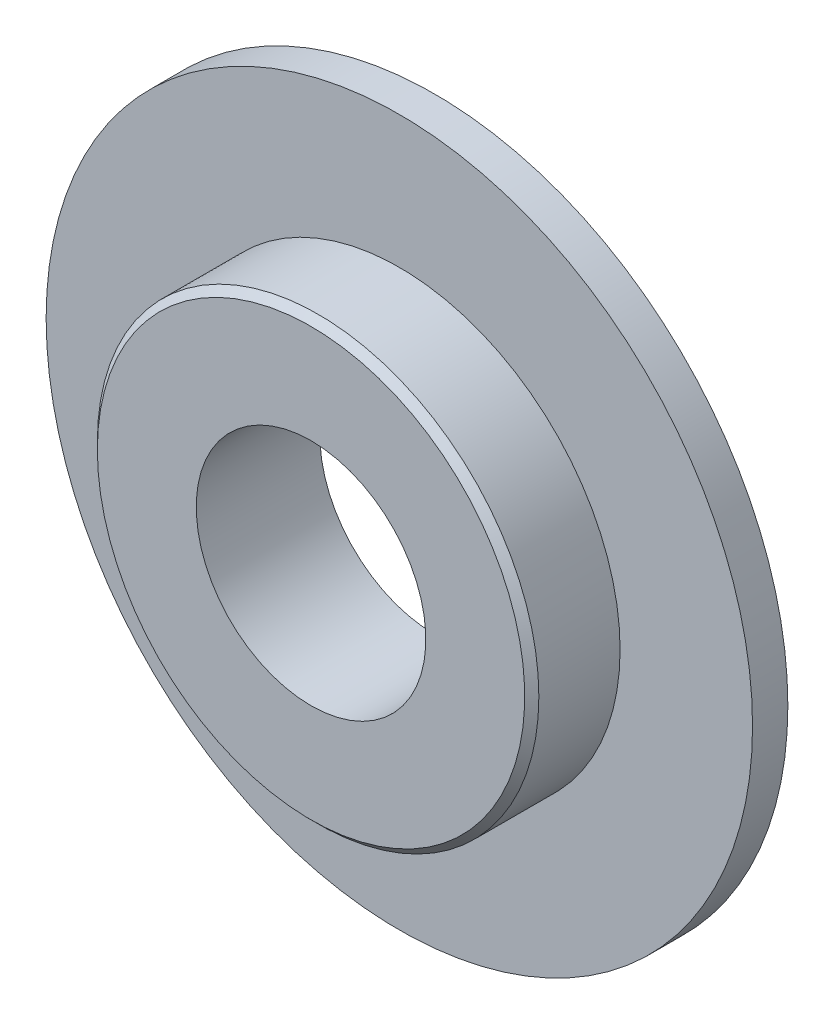
ISO-10303-21;
HEADER;
FILE_DESCRIPTION(('STEP AP214'),'2;1');
FILE_NAME('part.step','',(''),(''),'','','');
FILE_SCHEMA(('AUTOMOTIVE_DESIGN { 1 0 10303 214 1 1 1 1 }'));
ENDSEC;
DATA;
#1=APPLICATION_CONTEXT('core data for automotive mechanical design processes');
#2=APPLICATION_PROTOCOL_DEFINITION('international standard','automotive_design',2000,#1);
#3=PRODUCT_CONTEXT('',#1,'mechanical');
#4=PRODUCT('Part','Part','',(#3));
#5=PRODUCT_RELATED_PRODUCT_CATEGORY('part','',(#4));
#6=PRODUCT_DEFINITION_FORMATION('','',#4);
#7=PRODUCT_DEFINITION_CONTEXT('part definition',#1,'design');
#8=PRODUCT_DEFINITION('design','',#6,#7);
#9=PRODUCT_DEFINITION_SHAPE('','',#8);
#10=(LENGTH_UNIT() NAMED_UNIT(*) SI_UNIT(.MILLI.,.METRE.));
#11=(NAMED_UNIT(*) PLANE_ANGLE_UNIT() SI_UNIT($,.RADIAN.));
#12=(NAMED_UNIT(*) SI_UNIT($,.STERADIAN.) SOLID_ANGLE_UNIT());
#13=UNCERTAINTY_MEASURE_WITH_UNIT(LENGTH_MEASURE(1.E-05),#10,'distance_accuracy_value','');
#14=(GEOMETRIC_REPRESENTATION_CONTEXT(3) GLOBAL_UNCERTAINTY_ASSIGNED_CONTEXT((#13)) GLOBAL_UNIT_ASSIGNED_CONTEXT((#10,
#11,#12)) REPRESENTATION_CONTEXT('',''));
#15=CARTESIAN_POINT('',(0.,0.,0.));
#16=DIRECTION('',(0.,0.,1.));
#17=DIRECTION('',(1.,0.,0.));
#18=AXIS2_PLACEMENT_3D('',#15,#16,#17);
#19=CARTESIAN_POINT('',(0.,0.,-0.999999999999903));
#20=DIRECTION('',(0.,0.,1.));
#21=DIRECTION('',(1.,0.,0.));
#22=AXIS2_PLACEMENT_3D('',#19,#20,#21);
#23=CYLINDRICAL_SURFACE('',#22,10.);
#24=CARTESIAN_POINT('',(0.,0.,-0.999999999999903));
#25=DIRECTION('',(0.,0.,-1.));
#26=DIRECTION('',(-1.,0.,0.));
#27=AXIS2_PLACEMENT_3D('',#24,#25,#26);
#28=CIRCLE('',#27,10.);
#29=CARTESIAN_POINT('',(-10.,0.,-0.999999999999903));
#30=VERTEX_POINT('',#29);
#31=EDGE_CURVE('E46',#30,#30,#28,.T.);
#32=ORIENTED_EDGE('',*,*,#31,.F.);
#33=EDGE_LOOP('',(#32));
#34=FACE_BOUND('',#33,.T.);
#35=CARTESIAN_POINT('',(0.,0.,0.));
#36=DIRECTION('',(0.,0.,-1.));
#37=DIRECTION('',(-1.,0.,0.));
#38=AXIS2_PLACEMENT_3D('',#35,#36,#37);
#39=CIRCLE('',#38,10.);
#40=CARTESIAN_POINT('',(-10.,0.,0.));
#41=VERTEX_POINT('',#40);
#42=EDGE_CURVE('E49',#41,#41,#39,.T.);
#43=ORIENTED_EDGE('',*,*,#42,.T.);
#44=EDGE_LOOP('',(#43));
#45=FACE_BOUND('',#44,.T.);
#46=ADVANCED_FACE('F31',(#34,#45),#23,.T.);
#47=CARTESIAN_POINT('',(0.,0.,-0.999999999999903));
#48=DIRECTION('',(0.,0.,-1.));
#49=DIRECTION('',(-1.,0.,0.));
#50=AXIS2_PLACEMENT_3D('',#47,#48,#49);
#51=PLANE('',#50);
#52=CARTESIAN_POINT('',(0.,0.,-0.999999999999903));
#53=DIRECTION('',(0.,0.,-1.));
#54=DIRECTION('',(0.,1.,0.));
#55=AXIS2_PLACEMENT_3D('',#52,#53,#54);
#56=CIRCLE('',#55,3.25);
#57=CARTESIAN_POINT('',(0.,3.25,-0.999999999999903));
#58=VERTEX_POINT('',#57);
#59=EDGE_CURVE('E55',#58,#58,#56,.T.);
#60=ORIENTED_EDGE('',*,*,#59,.F.);
#61=EDGE_LOOP('',(#60));
#62=FACE_BOUND('',#61,.T.);
#63=ORIENTED_EDGE('',*,*,#31,.T.);
#64=EDGE_LOOP('',(#63));
#65=FACE_BOUND('',#64,.T.);
#66=ADVANCED_FACE('F69',(#62,#65),#51,.T.);
#67=CARTESIAN_POINT('',(0.,0.,0.));
#68=DIRECTION('',(0.,0.,-1.));
#69=DIRECTION('',(-1.,0.,0.));
#70=AXIS2_PLACEMENT_3D('',#67,#68,#69);
#71=PLANE('',#70);
#72=CARTESIAN_POINT('',(0.,0.,0.));
#73=DIRECTION('',(0.,0.,1.));
#74=DIRECTION('',(1.,0.,0.));
#75=AXIS2_PLACEMENT_3D('',#72,#73,#74);
#76=CIRCLE('',#75,6.25);
#77=CARTESIAN_POINT('',(6.25,0.,0.));
#78=VERTEX_POINT('',#77);
#79=EDGE_CURVE('E42',#78,#78,#76,.T.);
#80=ORIENTED_EDGE('',*,*,#79,.F.);
#81=EDGE_LOOP('',(#80));
#82=FACE_BOUND('',#81,.T.);
#83=ORIENTED_EDGE('',*,*,#42,.F.);
#84=EDGE_LOOP('',(#83));
#85=FACE_BOUND('',#84,.T.);
#86=ADVANCED_FACE('F72',(#82,#85),#71,.F.);
#87=CARTESIAN_POINT('',(0.,0.,2.5));
#88=DIRECTION('',(0.,0.,-1.));
#89=DIRECTION('',(-1.,0.,0.));
#90=AXIS2_PLACEMENT_3D('',#87,#88,#89);
#91=CYLINDRICAL_SURFACE('',#90,6.25);
#92=CARTESIAN_POINT('',(0.,0.,2.3));
#93=DIRECTION('',(0.,0.,1.));
#94=DIRECTION('',(1.,0.,0.));
#95=AXIS2_PLACEMENT_3D('',#92,#93,#94);
#96=CIRCLE('',#95,6.25);
#97=CARTESIAN_POINT('',(-6.25,0.,2.3));
#98=VERTEX_POINT('',#97);
#99=EDGE_CURVE('E10',#98,#98,#96,.F.);
#100=ORIENTED_EDGE('',*,*,#99,.T.);
#101=EDGE_LOOP('',(#100));
#102=FACE_BOUND('',#101,.T.);
#103=ORIENTED_EDGE('',*,*,#79,.T.);
#104=EDGE_LOOP('',(#103));
#105=FACE_BOUND('',#104,.T.);
#106=ADVANCED_FACE('F81',(#102,#105),#91,.T.);
#107=CARTESIAN_POINT('',(0.,0.,2.5));
#108=DIRECTION('',(0.,0.,1.));
#109=DIRECTION('',(1.,0.,0.));
#110=AXIS2_PLACEMENT_3D('',#107,#108,#109);
#111=PLANE('',#110);
#112=CARTESIAN_POINT('',(0.,0.,2.5));
#113=DIRECTION('',(0.,0.,1.));
#114=DIRECTION('',(1.,0.,0.));
#115=AXIS2_PLACEMENT_3D('',#112,#113,#114);
#116=CIRCLE('',#115,6.05);
#117=CARTESIAN_POINT('',(-6.05,0.,2.5));
#118=VERTEX_POINT('',#117);
#119=EDGE_CURVE('E38',#118,#118,#116,.T.);
#120=ORIENTED_EDGE('',*,*,#119,.T.);
#121=EDGE_LOOP('',(#120));
#122=FACE_BOUND('',#121,.T.);
#123=CARTESIAN_POINT('',(0.,0.,2.5));
#124=DIRECTION('',(0.,0.,-1.));
#125=DIRECTION('',(0.,1.,0.));
#126=AXIS2_PLACEMENT_3D('',#123,#124,#125);
#127=CIRCLE('',#126,3.25);
#128=CARTESIAN_POINT('',(0.,3.25,2.5));
#129=VERTEX_POINT('',#128);
#130=EDGE_CURVE('E52',#129,#129,#127,.T.);
#131=ORIENTED_EDGE('',*,*,#130,.T.);
#132=EDGE_LOOP('',(#131));
#133=FACE_BOUND('',#132,.T.);
#134=ADVANCED_FACE('F61',(#122,#133),#111,.T.);
#135=CARTESIAN_POINT('',(0.,0.,2.5));
#136=DIRECTION('',(0.,0.,-1.));
#137=DIRECTION('',(0.,1.,0.));
#138=AXIS2_PLACEMENT_3D('',#135,#136,#137);
#139=CYLINDRICAL_SURFACE('',#138,3.25);
#140=ORIENTED_EDGE('',*,*,#130,.F.);
#141=EDGE_LOOP('',(#140));
#142=FACE_BOUND('',#141,.T.);
#143=ORIENTED_EDGE('',*,*,#59,.T.);
#144=EDGE_LOOP('',(#143));
#145=FACE_BOUND('',#144,.T.);
#146=ADVANCED_FACE('F63',(#142,#145),#139,.F.);
#147=CARTESIAN_POINT('',(0.,0.,2.5));
#148=DIRECTION('',(0.,0.,-1.));
#149=DIRECTION('',(-1.,0.,0.));
#150=AXIS2_PLACEMENT_3D('',#147,#148,#149);
#151=CONICAL_SURFACE('',#150,6.05,0.785398163397444);
#152=CARTESIAN_POINT('',(-6.25,0.,2.3));
#153=CARTESIAN_POINT('',(-6.24791666666667,0.,2.30208333333333));
#154=CARTESIAN_POINT('',(-6.24583333333333,0.,2.30416666666667));
#155=CARTESIAN_POINT('',(-6.24166666666667,0.,2.30833333333333));
#156=CARTESIAN_POINT('',(-6.23958333333333,0.,2.31041666666667));
#157=CARTESIAN_POINT('',(-6.23541666666667,0.,2.31458333333333));
#158=CARTESIAN_POINT('',(-6.23333333333333,0.,2.31666666666667));
#159=CARTESIAN_POINT('',(-6.22916666666667,0.,2.32083333333333));
#160=CARTESIAN_POINT('',(-6.22708333333333,0.,2.32291666666667));
#161=CARTESIAN_POINT('',(-6.22291666666667,0.,2.32708333333333));
#162=CARTESIAN_POINT('',(-6.22083333333333,0.,2.32916666666667));
#163=CARTESIAN_POINT('',(-6.21666666666667,0.,2.33333333333333));
#164=CARTESIAN_POINT('',(-6.21458333333333,0.,2.33541666666667));
#165=CARTESIAN_POINT('',(-6.21041666666667,0.,2.33958333333333));
#166=CARTESIAN_POINT('',(-6.20833333333333,0.,2.34166666666667));
#167=CARTESIAN_POINT('',(-6.20416666666667,0.,2.34583333333333));
#168=CARTESIAN_POINT('',(-6.20208333333333,0.,2.34791666666667));
#169=CARTESIAN_POINT('',(-6.19791666666667,0.,2.35208333333333));
#170=CARTESIAN_POINT('',(-6.19583333333333,0.,2.35416666666667));
#171=CARTESIAN_POINT('',(-6.19166666666667,0.,2.35833333333333));
#172=CARTESIAN_POINT('',(-6.18958333333333,0.,2.36041666666667));
#173=CARTESIAN_POINT('',(-6.18541666666667,0.,2.36458333333333));
#174=CARTESIAN_POINT('',(-6.18333333333333,0.,2.36666666666667));
#175=CARTESIAN_POINT('',(-6.17916666666667,0.,2.37083333333333));
#176=CARTESIAN_POINT('',(-6.17708333333333,0.,2.37291666666667));
#177=CARTESIAN_POINT('',(-6.17291666666667,0.,2.37708333333333));
#178=CARTESIAN_POINT('',(-6.17083333333333,0.,2.37916666666667));
#179=CARTESIAN_POINT('',(-6.16666666666667,0.,2.38333333333333));
#180=CARTESIAN_POINT('',(-6.16458333333333,0.,2.38541666666667));
#181=CARTESIAN_POINT('',(-6.16041666666667,0.,2.38958333333333));
#182=CARTESIAN_POINT('',(-6.15833333333333,0.,2.39166666666667));
#183=CARTESIAN_POINT('',(-6.15416666666667,0.,2.39583333333333));
#184=CARTESIAN_POINT('',(-6.15208333333334,0.,2.39791666666667));
#185=CARTESIAN_POINT('',(-6.14791666666667,0.,2.40208333333333));
#186=CARTESIAN_POINT('',(-6.14583333333333,0.,2.40416666666667));
#187=CARTESIAN_POINT('',(-6.14166666666667,0.,2.40833333333333));
#188=CARTESIAN_POINT('',(-6.13958333333333,0.,2.41041666666667));
#189=CARTESIAN_POINT('',(-6.13541666666667,0.,2.41458333333333));
#190=CARTESIAN_POINT('',(-6.13333333333334,0.,2.41666666666667));
#191=CARTESIAN_POINT('',(-6.12916666666667,0.,2.42083333333333));
#192=CARTESIAN_POINT('',(-6.12708333333333,0.,2.42291666666667));
#193=CARTESIAN_POINT('',(-6.12291666666667,0.,2.42708333333333));
#194=CARTESIAN_POINT('',(-6.12083333333333,0.,2.42916666666667));
#195=CARTESIAN_POINT('',(-6.11666666666667,0.,2.43333333333333));
#196=CARTESIAN_POINT('',(-6.11458333333333,0.,2.43541666666667));
#197=CARTESIAN_POINT('',(-6.11041666666667,0.,2.43958333333333));
#198=CARTESIAN_POINT('',(-6.10833333333334,0.,2.44166666666667));
#199=CARTESIAN_POINT('',(-6.10416666666667,0.,2.44583333333333));
#200=CARTESIAN_POINT('',(-6.10208333333334,0.,2.44791666666667));
#201=CARTESIAN_POINT('',(-6.09791666666667,0.,2.45208333333333));
#202=CARTESIAN_POINT('',(-6.09583333333333,0.,2.45416666666667));
#203=CARTESIAN_POINT('',(-6.09166666666667,0.,2.45833333333333));
#204=CARTESIAN_POINT('',(-6.08958333333334,0.,2.46041666666667));
#205=CARTESIAN_POINT('',(-6.08541666666667,0.,2.46458333333333));
#206=CARTESIAN_POINT('',(-6.08333333333334,0.,2.46666666666667));
#207=CARTESIAN_POINT('',(-6.07916666666667,0.,2.47083333333333));
#208=CARTESIAN_POINT('',(-6.07708333333334,0.,2.47291666666667));
#209=CARTESIAN_POINT('',(-6.07291666666667,0.,2.47708333333333));
#210=CARTESIAN_POINT('',(-6.07083333333334,0.,2.47916666666667));
#211=CARTESIAN_POINT('',(-6.06666666666667,0.,2.48333333333333));
#212=CARTESIAN_POINT('',(-6.06458333333334,0.,2.48541666666667));
#213=CARTESIAN_POINT('',(-6.06041666666667,0.,2.48958333333333));
#214=CARTESIAN_POINT('',(-6.05833333333334,0.,2.49166666666667));
#215=CARTESIAN_POINT('',(-6.05416666666667,0.,2.49583333333333));
#216=CARTESIAN_POINT('',(-6.05208333333334,0.,2.49791666666667));
#217=CARTESIAN_POINT('',(-6.05,0.,2.5));
#218=B_SPLINE_CURVE_WITH_KNOTS('',3,(#152,#153,#154,#155,#156,#157,#158,#159,#160,#161,#162,
#163,#164,#165,#166,#167,#168,#169,#170,#171,#172,#173,#174,#175,#176,#177,#178,#179,#180,#181,
#182,#183,#184,#185,#186,#187,#188,#189,#190,#191,#192,#193,#194,#195,#196,#197,#198,#199,#200,
#201,#202,#203,#204,#205,#206,#207,#208,#209,#210,#211,#212,#213,#214,#215,#216,#217),
.UNSPECIFIED.,.F.,.F.,(4,2,2,2,2,2,2,2,2,2,2,2,2,2,2,2,2,2,2,2,2,2,2,2,2,2,2,2,2,2,2,2,4),(0.,
0.00883883476483118,0.0176776695296633,0.0265165042944951,0.0353553390593272,0.0441941738241583,
0.0530330085889904,0.0618718433538225,0.0707106781186543,0.0795495128834858,0.0883883476483176,
0.0972271824131497,0.106066017177981,0.114904851942813,0.123743686707645,0.132582521472477,
0.141421356237308,0.15026019100214,0.159099025766972,0.167937860531803,0.176776695296636,
0.185615530061467,0.194454364826299,0.203293199591131,0.212132034355963,0.220970869120795,
0.229809703885626,0.238648538650458,0.24748737341529,0.256326208180122,0.265165042944953,
0.274003877709785,0.282842712474617),.UNSPECIFIED.);
#219=EDGE_CURVE('BSEAM33',#98,#118,#218,.T.);
#220=ORIENTED_EDGE('',*,*,#99,.F.);
#221=ORIENTED_EDGE('',*,*,#119,.F.);
#222=ORIENTED_EDGE('',*,*,#219,.T.);
#223=ORIENTED_EDGE('',*,*,#219,.F.);
#224=EDGE_LOOP('',(#220,#222,#221,#223));
#225=FACE_BOUND('',#224,.T.);
#226=ADVANCED_FACE('F33',(#225),#151,.T.);
#227=CLOSED_SHELL('',(#46,#66,#86,#106,#134,#146,#226));
#228=MANIFOLD_SOLID_BREP('B2',#227);
#229=ADVANCED_BREP_SHAPE_REPRESENTATION('',(#18,#228),#14);
#230=SHAPE_DEFINITION_REPRESENTATION(#9,#229);
ENDSEC;
END-ISO-10303-21;
